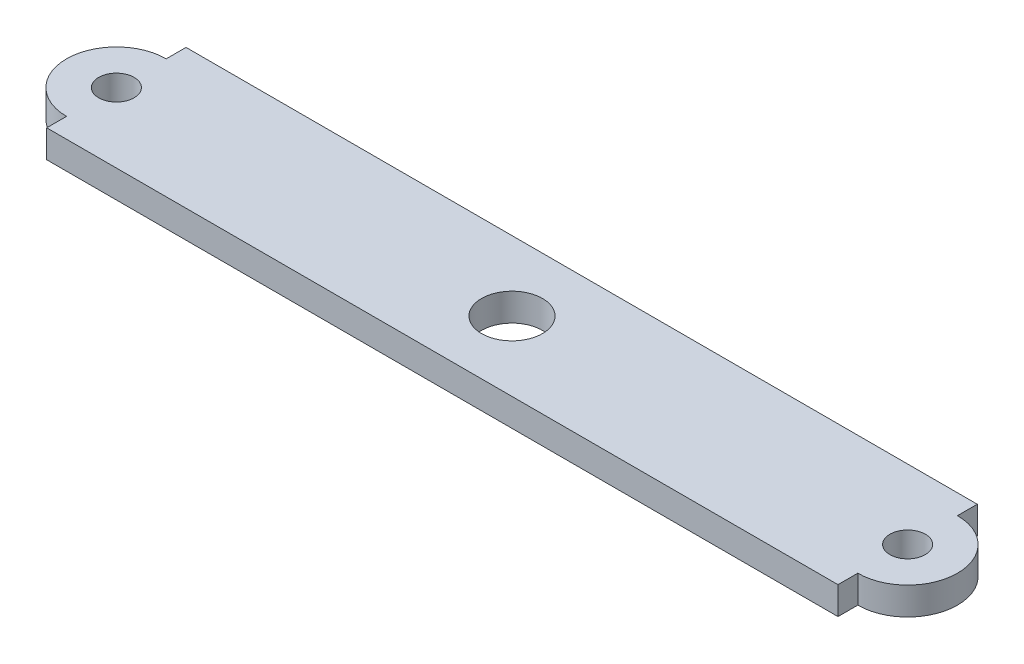
ISO-10303-21;
HEADER;
FILE_DESCRIPTION(('STEP AP214'),'2;1');
FILE_NAME('part.step','',(''),(''),'','','');
FILE_SCHEMA(('AUTOMOTIVE_DESIGN { 1 0 10303 214 1 1 1 1 }'));
ENDSEC;
DATA;
#1=APPLICATION_CONTEXT('core data for automotive mechanical design processes');
#2=APPLICATION_PROTOCOL_DEFINITION('international standard','automotive_design',2000,#1);
#3=PRODUCT_CONTEXT('',#1,'mechanical');
#4=PRODUCT('Part','Part','',(#3));
#5=PRODUCT_RELATED_PRODUCT_CATEGORY('part','',(#4));
#6=PRODUCT_DEFINITION_FORMATION('','',#4);
#7=PRODUCT_DEFINITION_CONTEXT('part definition',#1,'design');
#8=PRODUCT_DEFINITION('design','',#6,#7);
#9=PRODUCT_DEFINITION_SHAPE('','',#8);
#10=(LENGTH_UNIT() NAMED_UNIT(*) SI_UNIT(.MILLI.,.METRE.));
#11=(NAMED_UNIT(*) PLANE_ANGLE_UNIT() SI_UNIT($,.RADIAN.));
#12=(NAMED_UNIT(*) SI_UNIT($,.STERADIAN.) SOLID_ANGLE_UNIT());
#13=UNCERTAINTY_MEASURE_WITH_UNIT(LENGTH_MEASURE(1.E-05),#10,'distance_accuracy_value','');
#14=(GEOMETRIC_REPRESENTATION_CONTEXT(3) GLOBAL_UNCERTAINTY_ASSIGNED_CONTEXT((#13)) GLOBAL_UNIT_ASSIGNED_CONTEXT((#10,
#11,#12)) REPRESENTATION_CONTEXT('',''));
#15=CARTESIAN_POINT('',(0.,0.,0.));
#16=DIRECTION('',(0.,0.,1.));
#17=DIRECTION('',(1.,0.,0.));
#18=AXIS2_PLACEMENT_3D('',#15,#16,#17);
#19=CARTESIAN_POINT('',(35.7128085148514,2.5,0.));
#20=DIRECTION('',(0.,-1.,0.));
#21=DIRECTION('',(0.,0.,-1.));
#22=AXIS2_PLACEMENT_3D('',#19,#20,#21);
#23=CYLINDRICAL_SURFACE('',#22,4.5);
#24=CARTESIAN_POINT('',(35.7128085148514,0.,0.));
#25=DIRECTION('',(0.,1.,0.));
#26=DIRECTION('',(0.,0.,1.));
#27=AXIS2_PLACEMENT_3D('',#24,#25,#26);
#28=CIRCLE('',#27,4.5);
#29=CARTESIAN_POINT('',(35.7128085148514,0.,4.49999999999999));
#30=VERTEX_POINT('',#29);
#31=CARTESIAN_POINT('',(35.7128085148514,0.,-4.5));
#32=VERTEX_POINT('',#31);
#33=EDGE_CURVE('E142',#30,#32,#28,.T.);
#34=ORIENTED_EDGE('',*,*,#33,.T.);
#35=DIRECTION('',(0.,-1.,0.));
#36=VECTOR('',#35,1.);
#37=CARTESIAN_POINT('',(35.7128085148514,2.5,-4.5));
#38=LINE('',#37,#36);
#39=CARTESIAN_POINT('',(35.7128085148514,2.5,-4.5));
#40=VERTEX_POINT('',#39);
#41=EDGE_CURVE('E11',#40,#32,#38,.T.);
#42=ORIENTED_EDGE('',*,*,#41,.F.);
#43=CARTESIAN_POINT('',(35.7128085148514,2.5,0.));
#44=DIRECTION('',(0.,1.,0.));
#45=DIRECTION('',(0.,0.,1.));
#46=AXIS2_PLACEMENT_3D('',#43,#44,#45);
#47=CIRCLE('',#46,4.5);
#48=CARTESIAN_POINT('',(35.7128085148514,2.5,4.49999999999999));
#49=VERTEX_POINT('',#48);
#50=EDGE_CURVE('E189',#49,#40,#47,.T.);
#51=ORIENTED_EDGE('',*,*,#50,.F.);
#52=DIRECTION('',(0.,-1.,0.));
#53=VECTOR('',#52,1.);
#54=CARTESIAN_POINT('',(35.7128085148514,2.5,4.49999999999999));
#55=LINE('',#54,#53);
#56=EDGE_CURVE('E138',#49,#30,#55,.T.);
#57=ORIENTED_EDGE('',*,*,#56,.T.);
#58=EDGE_LOOP('',(#34,#42,#51,#57));
#59=FACE_BOUND('',#58,.T.);
#60=ADVANCED_FACE('F35',(#59),#23,.T.);
#61=CARTESIAN_POINT('',(35.7128085148514,2.5,0.));
#62=DIRECTION('',(-1.,0.,0.));
#63=DIRECTION('',(0.,0.,1.));
#64=AXIS2_PLACEMENT_3D('',#61,#62,#63);
#65=PLANE('',#64);
#66=DIRECTION('',(0.,0.,-1.));
#67=VECTOR('',#66,1.);
#68=CARTESIAN_POINT('',(35.7128085148514,0.,0.));
#69=LINE('',#68,#67);
#70=CARTESIAN_POINT('',(35.7128085148514,0.,-6.2871914851485));
#71=VERTEX_POINT('',#70);
#72=EDGE_CURVE('E145',#32,#71,#69,.T.);
#73=ORIENTED_EDGE('',*,*,#72,.T.);
#74=DIRECTION('',(0.,-1.,0.));
#75=VECTOR('',#74,1.);
#76=CARTESIAN_POINT('',(35.7128085148514,2.5,-6.2871914851485));
#77=LINE('',#76,#75);
#78=CARTESIAN_POINT('',(35.7128085148514,2.5,-6.2871914851485));
#79=VERTEX_POINT('',#78);
#80=EDGE_CURVE('E44',#79,#71,#77,.T.);
#81=ORIENTED_EDGE('',*,*,#80,.F.);
#82=DIRECTION('',(0.,0.,-1.));
#83=VECTOR('',#82,1.);
#84=CARTESIAN_POINT('',(35.7128085148514,2.5,0.));
#85=LINE('',#84,#83);
#86=EDGE_CURVE('E91',#40,#79,#85,.T.);
#87=ORIENTED_EDGE('',*,*,#86,.F.);
#88=ORIENTED_EDGE('',*,*,#41,.T.);
#89=EDGE_LOOP('',(#73,#81,#87,#88));
#90=FACE_BOUND('',#89,.T.);
#91=ADVANCED_FACE('F208',(#90),#65,.F.);
#92=CARTESIAN_POINT('',(0.,2.5,-6.2871914851485));
#93=DIRECTION('',(0.,0.,1.));
#94=DIRECTION('',(1.,0.,0.));
#95=AXIS2_PLACEMENT_3D('',#92,#93,#94);
#96=PLANE('',#95);
#97=DIRECTION('',(-1.,0.,0.));
#98=VECTOR('',#97,1.);
#99=CARTESIAN_POINT('',(0.,0.,-6.2871914851485));
#100=LINE('',#99,#98);
#101=CARTESIAN_POINT('',(-35.7128085148516,0.,-6.28719148514849));
#102=VERTEX_POINT('',#101);
#103=EDGE_CURVE('E147',#71,#102,#100,.T.);
#104=ORIENTED_EDGE('',*,*,#103,.T.);
#105=DIRECTION('',(0.,-1.,0.));
#106=VECTOR('',#105,1.);
#107=CARTESIAN_POINT('',(-35.7128085148516,2.5,-6.28719148514849));
#108=LINE('',#107,#106);
#109=CARTESIAN_POINT('',(-35.7128085148516,2.5,-6.28719148514849));
#110=VERTEX_POINT('',#109);
#111=EDGE_CURVE('E170',#110,#102,#108,.T.);
#112=ORIENTED_EDGE('',*,*,#111,.F.);
#113=DIRECTION('',(-1.,0.,0.));
#114=VECTOR('',#113,1.);
#115=CARTESIAN_POINT('',(0.,2.5,-6.2871914851485));
#116=LINE('',#115,#114);
#117=EDGE_CURVE('E177',#79,#110,#116,.T.);
#118=ORIENTED_EDGE('',*,*,#117,.F.);
#119=ORIENTED_EDGE('',*,*,#80,.T.);
#120=EDGE_LOOP('',(#104,#112,#118,#119));
#121=FACE_BOUND('',#120,.T.);
#122=ADVANCED_FACE('F175',(#121),#96,.F.);
#123=CARTESIAN_POINT('',(-35.7128085148516,2.5,0.));
#124=DIRECTION('',(-1.,0.,0.));
#125=DIRECTION('',(0.,0.,1.));
#126=AXIS2_PLACEMENT_3D('',#123,#124,#125);
#127=PLANE('',#126);
#128=DIRECTION('',(0.,0.,-1.));
#129=VECTOR('',#128,1.);
#130=CARTESIAN_POINT('',(-35.7128085148516,0.,0.));
#131=LINE('',#130,#129);
#132=CARTESIAN_POINT('',(-35.7128085148516,0.,-4.5));
#133=VERTEX_POINT('',#132);
#134=EDGE_CURVE('E150',#133,#102,#131,.T.);
#135=ORIENTED_EDGE('',*,*,#134,.F.);
#136=DIRECTION('',(0.,-1.,0.));
#137=VECTOR('',#136,1.);
#138=CARTESIAN_POINT('',(-35.7128085148516,2.5,-4.5));
#139=LINE('',#138,#137);
#140=CARTESIAN_POINT('',(-35.7128085148516,2.5,-4.5));
#141=VERTEX_POINT('',#140);
#142=EDGE_CURVE('E168',#141,#133,#139,.T.);
#143=ORIENTED_EDGE('',*,*,#142,.F.);
#144=DIRECTION('',(0.,0.,-1.));
#145=VECTOR('',#144,1.);
#146=CARTESIAN_POINT('',(-35.7128085148516,2.5,0.));
#147=LINE('',#146,#145);
#148=EDGE_CURVE('E126',#141,#110,#147,.T.);
#149=ORIENTED_EDGE('',*,*,#148,.T.);
#150=ORIENTED_EDGE('',*,*,#111,.T.);
#151=EDGE_LOOP('',(#135,#143,#149,#150));
#152=FACE_BOUND('',#151,.T.);
#153=ADVANCED_FACE('F185',(#152),#127,.T.);
#154=CARTESIAN_POINT('',(-35.7128085148516,2.5,0.));
#155=DIRECTION('',(0.,-1.,0.));
#156=DIRECTION('',(0.,0.,-1.));
#157=AXIS2_PLACEMENT_3D('',#154,#155,#156);
#158=CYLINDRICAL_SURFACE('',#157,4.5);
#159=CARTESIAN_POINT('',(-35.7128085148516,0.,0.));
#160=DIRECTION('',(0.,1.,0.));
#161=DIRECTION('',(0.,0.,1.));
#162=AXIS2_PLACEMENT_3D('',#159,#160,#161);
#163=CIRCLE('',#162,4.5);
#164=CARTESIAN_POINT('',(-35.7128085148516,0.,4.50000000000001));
#165=VERTEX_POINT('',#164);
#166=EDGE_CURVE('E153',#133,#165,#163,.T.);
#167=ORIENTED_EDGE('',*,*,#166,.T.);
#168=DIRECTION('',(0.,-1.,0.));
#169=VECTOR('',#168,1.);
#170=CARTESIAN_POINT('',(-35.7128085148516,2.5,4.50000000000001));
#171=LINE('',#170,#169);
#172=CARTESIAN_POINT('',(-35.7128085148516,2.5,4.50000000000001));
#173=VERTEX_POINT('',#172);
#174=EDGE_CURVE('E116',#173,#165,#171,.T.);
#175=ORIENTED_EDGE('',*,*,#174,.F.);
#176=CARTESIAN_POINT('',(-35.7128085148516,2.5,0.));
#177=DIRECTION('',(0.,1.,0.));
#178=DIRECTION('',(0.,0.,1.));
#179=AXIS2_PLACEMENT_3D('',#176,#177,#178);
#180=CIRCLE('',#179,4.5);
#181=EDGE_CURVE('E123',#141,#173,#180,.T.);
#182=ORIENTED_EDGE('',*,*,#181,.F.);
#183=ORIENTED_EDGE('',*,*,#142,.T.);
#184=EDGE_LOOP('',(#167,#175,#182,#183));
#185=FACE_BOUND('',#184,.T.);
#186=ADVANCED_FACE('F218',(#185),#158,.T.);
#187=CARTESIAN_POINT('',(-35.7128085148516,0.,6.28719148514851));
#188=VERTEX_POINT('',#187);
#189=EDGE_CURVE('E111',#188,#165,#131,.T.);
#190=ORIENTED_EDGE('',*,*,#189,.F.);
#191=DIRECTION('',(0.,-1.,0.));
#192=VECTOR('',#191,1.);
#193=CARTESIAN_POINT('',(-35.7128085148516,2.5,6.28719148514851));
#194=LINE('',#193,#192);
#195=CARTESIAN_POINT('',(-35.7128085148516,2.5,6.28719148514851));
#196=VERTEX_POINT('',#195);
#197=EDGE_CURVE('E106',#196,#188,#194,.T.);
#198=ORIENTED_EDGE('',*,*,#197,.F.);
#199=EDGE_CURVE('E109',#196,#173,#147,.T.);
#200=ORIENTED_EDGE('',*,*,#199,.T.);
#201=ORIENTED_EDGE('',*,*,#174,.T.);
#202=EDGE_LOOP('',(#190,#198,#200,#201));
#203=FACE_BOUND('',#202,.T.);
#204=ADVANCED_FACE('F108',(#203),#127,.T.);
#205=CARTESIAN_POINT('',(0.,2.5,6.2871914851485));
#206=DIRECTION('',(0.,0.,1.));
#207=DIRECTION('',(1.,0.,0.));
#208=AXIS2_PLACEMENT_3D('',#205,#206,#207);
#209=PLANE('',#208);
#210=DIRECTION('',(-1.,0.,0.));
#211=VECTOR('',#210,1.);
#212=CARTESIAN_POINT('',(0.,0.,6.2871914851485));
#213=LINE('',#212,#211);
#214=CARTESIAN_POINT('',(35.7128085148514,0.,6.2871914851485));
#215=VERTEX_POINT('',#214);
#216=EDGE_CURVE('E156',#215,#188,#213,.T.);
#217=ORIENTED_EDGE('',*,*,#216,.F.);
#218=DIRECTION('',(0.,-1.,0.));
#219=VECTOR('',#218,1.);
#220=CARTESIAN_POINT('',(35.7128085148514,2.5,6.2871914851485));
#221=LINE('',#220,#219);
#222=CARTESIAN_POINT('',(35.7128085148514,2.5,6.2871914851485));
#223=VERTEX_POINT('',#222);
#224=EDGE_CURVE('E80',#223,#215,#221,.T.);
#225=ORIENTED_EDGE('',*,*,#224,.F.);
#226=DIRECTION('',(-1.,0.,0.));
#227=VECTOR('',#226,1.);
#228=CARTESIAN_POINT('',(0.,2.5,6.2871914851485));
#229=LINE('',#228,#227);
#230=EDGE_CURVE('E120',#223,#196,#229,.T.);
#231=ORIENTED_EDGE('',*,*,#230,.T.);
#232=ORIENTED_EDGE('',*,*,#197,.T.);
#233=EDGE_LOOP('',(#217,#225,#231,#232));
#234=FACE_BOUND('',#233,.T.);
#235=ADVANCED_FACE('F127',(#234),#209,.T.);
#236=CARTESIAN_POINT('',(1.11022302462516E-13,2.5,0.));
#237=DIRECTION('',(0.,-1.,0.));
#238=DIRECTION('',(0.,0.,-1.));
#239=AXIS2_PLACEMENT_3D('',#236,#237,#238);
#240=CYLINDRICAL_SURFACE('',#239,2.75);
#241=CARTESIAN_POINT('',(1.11022302462516E-13,2.5,0.));
#242=DIRECTION('',(0.,1.,0.));
#243=DIRECTION('',(0.,0.,1.));
#244=AXIS2_PLACEMENT_3D('',#241,#242,#243);
#245=CIRCLE('',#244,2.75);
#246=CARTESIAN_POINT('',(1.11022302462516E-13,2.5,2.75));
#247=VERTEX_POINT('',#246);
#248=EDGE_CURVE('E129',#247,#247,#245,.T.);
#249=ORIENTED_EDGE('',*,*,#248,.T.);
#250=EDGE_LOOP('',(#249));
#251=FACE_BOUND('',#250,.T.);
#252=CARTESIAN_POINT('',(1.11022302462516E-13,0.,0.));
#253=DIRECTION('',(0.,1.,0.));
#254=DIRECTION('',(0.,0.,1.));
#255=AXIS2_PLACEMENT_3D('',#252,#253,#254);
#256=CIRCLE('',#255,2.75);
#257=CARTESIAN_POINT('',(1.11022302462516E-13,0.,2.75));
#258=VERTEX_POINT('',#257);
#259=EDGE_CURVE('E158',#258,#258,#256,.T.);
#260=ORIENTED_EDGE('',*,*,#259,.F.);
#261=EDGE_LOOP('',(#260));
#262=FACE_BOUND('',#261,.T.);
#263=ADVANCED_FACE('F225',(#251,#262),#240,.F.);
#264=EDGE_CURVE('E83',#215,#30,#69,.T.);
#265=ORIENTED_EDGE('',*,*,#264,.T.);
#266=ORIENTED_EDGE('',*,*,#56,.F.);
#267=EDGE_CURVE('E52',#223,#49,#85,.T.);
#268=ORIENTED_EDGE('',*,*,#267,.F.);
#269=ORIENTED_EDGE('',*,*,#224,.T.);
#270=EDGE_LOOP('',(#265,#266,#268,#269));
#271=FACE_BOUND('',#270,.T.);
#272=ADVANCED_FACE('F214',(#271),#65,.F.);
#273=CARTESIAN_POINT('',(-35.7128085148516,2.5,0.));
#274=DIRECTION('',(0.,-1.,0.));
#275=DIRECTION('',(0.,0.,-1.));
#276=AXIS2_PLACEMENT_3D('',#273,#274,#275);
#277=CYLINDRICAL_SURFACE('',#276,1.6);
#278=CARTESIAN_POINT('',(-35.7128085148516,2.5,0.));
#279=DIRECTION('',(0.,1.,0.));
#280=DIRECTION('',(0.,0.,1.));
#281=AXIS2_PLACEMENT_3D('',#278,#279,#280);
#282=CIRCLE('',#281,1.6);
#283=CARTESIAN_POINT('',(-35.7128085148516,2.5,1.6));
#284=VERTEX_POINT('',#283);
#285=EDGE_CURVE('E164',#284,#284,#282,.T.);
#286=ORIENTED_EDGE('',*,*,#285,.T.);
#287=EDGE_LOOP('',(#286));
#288=FACE_BOUND('',#287,.T.);
#289=CARTESIAN_POINT('',(-35.7128085148516,0.,0.));
#290=DIRECTION('',(0.,1.,0.));
#291=DIRECTION('',(0.,0.,1.));
#292=AXIS2_PLACEMENT_3D('',#289,#290,#291);
#293=CIRCLE('',#292,1.6);
#294=CARTESIAN_POINT('',(-35.7128085148516,0.,1.6));
#295=VERTEX_POINT('',#294);
#296=EDGE_CURVE('E139',#295,#295,#293,.T.);
#297=ORIENTED_EDGE('',*,*,#296,.F.);
#298=EDGE_LOOP('',(#297));
#299=FACE_BOUND('',#298,.T.);
#300=ADVANCED_FACE('F37',(#288,#299),#277,.F.);
#301=CARTESIAN_POINT('',(35.7128085148514,2.5,0.));
#302=DIRECTION('',(0.,-1.,0.));
#303=DIRECTION('',(0.,0.,-1.));
#304=AXIS2_PLACEMENT_3D('',#301,#302,#303);
#305=CYLINDRICAL_SURFACE('',#304,1.6);
#306=CARTESIAN_POINT('',(35.7128085148514,2.5,0.));
#307=DIRECTION('',(0.,1.,0.));
#308=DIRECTION('',(0.,0.,1.));
#309=AXIS2_PLACEMENT_3D('',#306,#307,#308);
#310=CIRCLE('',#309,1.6);
#311=CARTESIAN_POINT('',(35.7128085148514,2.5,1.59999999999999));
#312=VERTEX_POINT('',#311);
#313=EDGE_CURVE('E135',#312,#312,#310,.T.);
#314=ORIENTED_EDGE('',*,*,#313,.T.);
#315=EDGE_LOOP('',(#314));
#316=FACE_BOUND('',#315,.T.);
#317=CARTESIAN_POINT('',(35.7128085148514,0.,0.));
#318=DIRECTION('',(0.,1.,0.));
#319=DIRECTION('',(0.,0.,1.));
#320=AXIS2_PLACEMENT_3D('',#317,#318,#319);
#321=CIRCLE('',#320,1.6);
#322=CARTESIAN_POINT('',(35.7128085148514,0.,1.59999999999999));
#323=VERTEX_POINT('',#322);
#324=EDGE_CURVE('E161',#323,#323,#321,.T.);
#325=ORIENTED_EDGE('',*,*,#324,.F.);
#326=EDGE_LOOP('',(#325));
#327=FACE_BOUND('',#326,.T.);
#328=ADVANCED_FACE('F197',(#316,#327),#305,.F.);
#329=CARTESIAN_POINT('',(0.,2.5,0.));
#330=DIRECTION('',(0.,1.,0.));
#331=DIRECTION('',(0.,0.,1.));
#332=AXIS2_PLACEMENT_3D('',#329,#330,#331);
#333=PLANE('',#332);
#334=ORIENTED_EDGE('',*,*,#285,.F.);
#335=EDGE_LOOP('',(#334));
#336=FACE_BOUND('',#335,.T.);
#337=ORIENTED_EDGE('',*,*,#50,.T.);
#338=ORIENTED_EDGE('',*,*,#86,.T.);
#339=ORIENTED_EDGE('',*,*,#117,.T.);
#340=ORIENTED_EDGE('',*,*,#148,.F.);
#341=ORIENTED_EDGE('',*,*,#181,.T.);
#342=ORIENTED_EDGE('',*,*,#199,.F.);
#343=ORIENTED_EDGE('',*,*,#230,.F.);
#344=ORIENTED_EDGE('',*,*,#267,.T.);
#345=EDGE_LOOP('',(#337,#338,#339,#340,#341,#342,#343,#344));
#346=FACE_BOUND('',#345,.T.);
#347=ORIENTED_EDGE('',*,*,#248,.F.);
#348=EDGE_LOOP('',(#347));
#349=FACE_BOUND('',#348,.T.);
#350=ORIENTED_EDGE('',*,*,#313,.F.);
#351=EDGE_LOOP('',(#350));
#352=FACE_BOUND('',#351,.T.);
#353=ADVANCED_FACE('F118',(#336,#346,#349,#352),#333,.T.);
#354=CARTESIAN_POINT('',(0.,0.,0.));
#355=DIRECTION('',(0.,1.,0.));
#356=DIRECTION('',(0.,0.,1.));
#357=AXIS2_PLACEMENT_3D('',#354,#355,#356);
#358=PLANE('',#357);
#359=ORIENTED_EDGE('',*,*,#296,.T.);
#360=EDGE_LOOP('',(#359));
#361=FACE_BOUND('',#360,.T.);
#362=ORIENTED_EDGE('',*,*,#33,.F.);
#363=ORIENTED_EDGE('',*,*,#264,.F.);
#364=ORIENTED_EDGE('',*,*,#216,.T.);
#365=ORIENTED_EDGE('',*,*,#189,.T.);
#366=ORIENTED_EDGE('',*,*,#166,.F.);
#367=ORIENTED_EDGE('',*,*,#134,.T.);
#368=ORIENTED_EDGE('',*,*,#103,.F.);
#369=ORIENTED_EDGE('',*,*,#72,.F.);
#370=EDGE_LOOP('',(#362,#363,#364,#365,#366,#367,#368,#369));
#371=FACE_BOUND('',#370,.T.);
#372=ORIENTED_EDGE('',*,*,#259,.T.);
#373=EDGE_LOOP('',(#372));
#374=FACE_BOUND('',#373,.T.);
#375=ORIENTED_EDGE('',*,*,#324,.T.);
#376=EDGE_LOOP('',(#375));
#377=FACE_BOUND('',#376,.T.);
#378=ADVANCED_FACE('F180',(#361,#371,#374,#377),#358,.F.);
#379=CLOSED_SHELL('',(#60,#91,#122,#153,#186,#204,#235,#263,#272,#300,#328,#353,#378));
#380=MANIFOLD_SOLID_BREP('B2',#379);
#381=ADVANCED_BREP_SHAPE_REPRESENTATION('',(#18,#380),#14);
#382=SHAPE_DEFINITION_REPRESENTATION(#9,#381);
ENDSEC;
END-ISO-10303-21;
